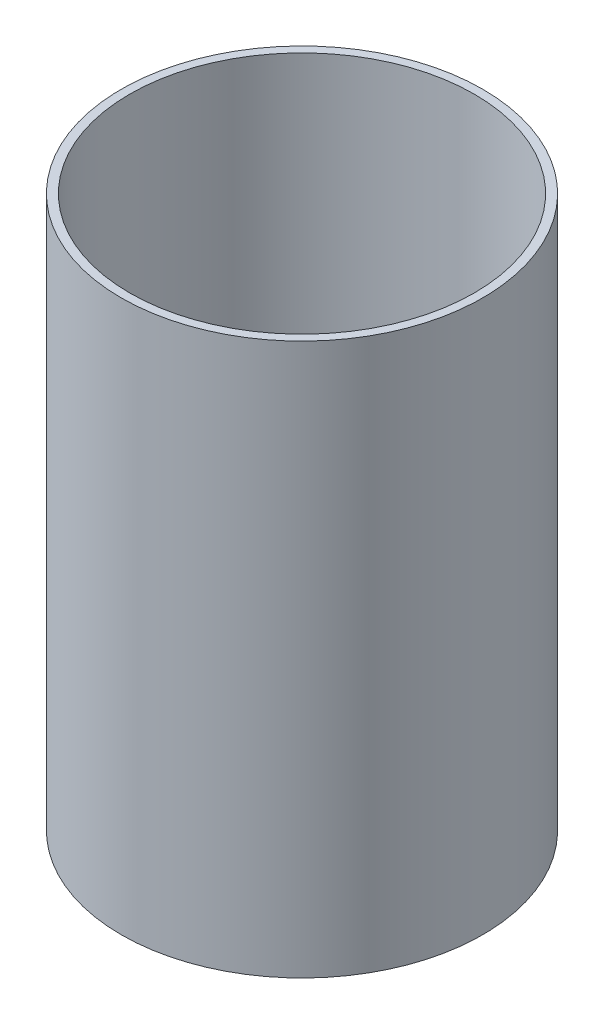
ISO-10303-21;
HEADER;
FILE_DESCRIPTION(('STEP AP214'),'2;1');
FILE_NAME('part.step','',(''),(''),'','','');
FILE_SCHEMA(('AUTOMOTIVE_DESIGN { 1 0 10303 214 1 1 1 1 }'));
ENDSEC;
DATA;
#1=APPLICATION_CONTEXT('core data for automotive mechanical design processes');
#2=APPLICATION_PROTOCOL_DEFINITION('international standard','automotive_design',2000,#1);
#3=PRODUCT_CONTEXT('',#1,'mechanical');
#4=PRODUCT('Part','Part','',(#3));
#5=PRODUCT_RELATED_PRODUCT_CATEGORY('part','',(#4));
#6=PRODUCT_DEFINITION_FORMATION('','',#4);
#7=PRODUCT_DEFINITION_CONTEXT('part definition',#1,'design');
#8=PRODUCT_DEFINITION('design','',#6,#7);
#9=PRODUCT_DEFINITION_SHAPE('','',#8);
#10=(LENGTH_UNIT() NAMED_UNIT(*) SI_UNIT(.MILLI.,.METRE.));
#11=(NAMED_UNIT(*) PLANE_ANGLE_UNIT() SI_UNIT($,.RADIAN.));
#12=(NAMED_UNIT(*) SI_UNIT($,.STERADIAN.) SOLID_ANGLE_UNIT());
#13=UNCERTAINTY_MEASURE_WITH_UNIT(LENGTH_MEASURE(1.E-05),#10,'distance_accuracy_value','');
#14=(GEOMETRIC_REPRESENTATION_CONTEXT(3) GLOBAL_UNCERTAINTY_ASSIGNED_CONTEXT((#13)) GLOBAL_UNIT_ASSIGNED_CONTEXT((#10,
#11,#12)) REPRESENTATION_CONTEXT('',''));
#15=CARTESIAN_POINT('',(0.,0.,0.));
#16=DIRECTION('',(0.,0.,1.));
#17=DIRECTION('',(1.,0.,0.));
#18=AXIS2_PLACEMENT_3D('',#15,#16,#17);
#19=CARTESIAN_POINT('',(0.,32.5,0.));
#20=DIRECTION('',(0.,1.,0.));
#21=DIRECTION('',(0.,0.,1.));
#22=AXIS2_PLACEMENT_3D('',#19,#20,#21);
#23=PLANE('',#22);
#24=CARTESIAN_POINT('',(0.,32.5,0.));
#25=DIRECTION('',(0.,1.,0.));
#26=DIRECTION('',(0.,0.,1.));
#27=AXIS2_PLACEMENT_3D('',#24,#25,#26);
#28=CIRCLE('',#27,10.65);
#29=CARTESIAN_POINT('',(0.,32.5,10.65));
#30=VERTEX_POINT('',#29);
#31=EDGE_CURVE('E10',#30,#30,#28,.T.);
#32=ORIENTED_EDGE('',*,*,#31,.T.);
#33=EDGE_LOOP('',(#32));
#34=FACE_BOUND('',#33,.T.);
#35=CARTESIAN_POINT('',(0.,32.5,0.));
#36=DIRECTION('',(0.,1.,0.));
#37=DIRECTION('',(0.,0.,1.));
#38=AXIS2_PLACEMENT_3D('',#35,#36,#37);
#39=CIRCLE('',#38,10.15);
#40=CARTESIAN_POINT('',(0.,32.5,10.15));
#41=VERTEX_POINT('',#40);
#42=EDGE_CURVE('E45',#41,#41,#39,.T.);
#43=ORIENTED_EDGE('',*,*,#42,.F.);
#44=EDGE_LOOP('',(#43));
#45=FACE_BOUND('',#44,.T.);
#46=ADVANCED_FACE('F34',(#34,#45),#23,.T.);
#47=CARTESIAN_POINT('',(0.,0.,0.));
#48=DIRECTION('',(0.,1.,0.));
#49=DIRECTION('',(0.,0.,1.));
#50=AXIS2_PLACEMENT_3D('',#47,#48,#49);
#51=PLANE('',#50);
#52=CARTESIAN_POINT('',(0.,0.,0.));
#53=DIRECTION('',(0.,1.,0.));
#54=DIRECTION('',(0.,0.,1.));
#55=AXIS2_PLACEMENT_3D('',#52,#53,#54);
#56=CIRCLE('',#55,10.65);
#57=CARTESIAN_POINT('',(0.,0.,10.65));
#58=VERTEX_POINT('',#57);
#59=EDGE_CURVE('E38',#58,#58,#56,.T.);
#60=ORIENTED_EDGE('',*,*,#59,.F.);
#61=EDGE_LOOP('',(#60));
#62=FACE_BOUND('',#61,.T.);
#63=CARTESIAN_POINT('',(0.,0.,0.));
#64=DIRECTION('',(0.,1.,0.));
#65=DIRECTION('',(0.,0.,1.));
#66=AXIS2_PLACEMENT_3D('',#63,#64,#65);
#67=CIRCLE('',#66,10.15);
#68=CARTESIAN_POINT('',(0.,0.,10.15));
#69=VERTEX_POINT('',#68);
#70=EDGE_CURVE('E47',#69,#69,#67,.T.);
#71=ORIENTED_EDGE('',*,*,#70,.T.);
#72=EDGE_LOOP('',(#71));
#73=FACE_BOUND('',#72,.T.);
#74=ADVANCED_FACE('F57',(#62,#73),#51,.F.);
#75=CARTESIAN_POINT('',(0.,32.5,0.));
#76=DIRECTION('',(0.,-1.,0.));
#77=DIRECTION('',(0.,0.,-1.));
#78=AXIS2_PLACEMENT_3D('',#75,#76,#77);
#79=CYLINDRICAL_SURFACE('',#78,10.65);
#80=ORIENTED_EDGE('',*,*,#31,.F.);
#81=EDGE_LOOP('',(#80));
#82=FACE_BOUND('',#81,.T.);
#83=ORIENTED_EDGE('',*,*,#59,.T.);
#84=EDGE_LOOP('',(#83));
#85=FACE_BOUND('',#84,.T.);
#86=ADVANCED_FACE('F36',(#82,#85),#79,.T.);
#87=CARTESIAN_POINT('',(0.,32.5,0.));
#88=DIRECTION('',(0.,-1.,0.));
#89=DIRECTION('',(0.,0.,-1.));
#90=AXIS2_PLACEMENT_3D('',#87,#88,#89);
#91=CYLINDRICAL_SURFACE('',#90,10.15);
#92=ORIENTED_EDGE('',*,*,#42,.T.);
#93=EDGE_LOOP('',(#92));
#94=FACE_BOUND('',#93,.T.);
#95=ORIENTED_EDGE('',*,*,#70,.F.);
#96=EDGE_LOOP('',(#95));
#97=FACE_BOUND('',#96,.T.);
#98=ADVANCED_FACE('F53',(#94,#97),#91,.F.);
#99=CLOSED_SHELL('',(#46,#74,#86,#98));
#100=MANIFOLD_SOLID_BREP('B2',#99);
#101=ADVANCED_BREP_SHAPE_REPRESENTATION('',(#18,#100),#14);
#102=SHAPE_DEFINITION_REPRESENTATION(#9,#101);
ENDSEC;
END-ISO-10303-21;
